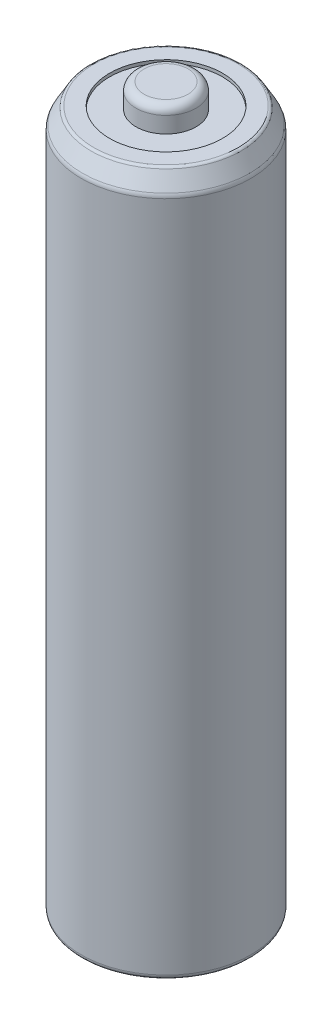
ISO-10303-21;
HEADER;
FILE_DESCRIPTION(('STEP AP214'),'2;1');
FILE_NAME('part.step','',(''),(''),'','','');
FILE_SCHEMA(('AUTOMOTIVE_DESIGN { 1 0 10303 214 1 1 1 1 }'));
ENDSEC;
DATA;
#1=APPLICATION_CONTEXT('core data for automotive mechanical design processes');
#2=APPLICATION_PROTOCOL_DEFINITION('international standard','automotive_design',2000,#1);
#3=PRODUCT_CONTEXT('',#1,'mechanical');
#4=PRODUCT('Part','Part','',(#3));
#5=PRODUCT_RELATED_PRODUCT_CATEGORY('part','',(#4));
#6=PRODUCT_DEFINITION_FORMATION('','',#4);
#7=PRODUCT_DEFINITION_CONTEXT('part definition',#1,'design');
#8=PRODUCT_DEFINITION('design','',#6,#7);
#9=PRODUCT_DEFINITION_SHAPE('','',#8);
#10=(LENGTH_UNIT() NAMED_UNIT(*) SI_UNIT(.MILLI.,.METRE.));
#11=(NAMED_UNIT(*) PLANE_ANGLE_UNIT() SI_UNIT($,.RADIAN.));
#12=(NAMED_UNIT(*) SI_UNIT($,.STERADIAN.) SOLID_ANGLE_UNIT());
#13=UNCERTAINTY_MEASURE_WITH_UNIT(LENGTH_MEASURE(1.E-05),#10,'distance_accuracy_value','');
#14=(GEOMETRIC_REPRESENTATION_CONTEXT(3) GLOBAL_UNCERTAINTY_ASSIGNED_CONTEXT((#13)) GLOBAL_UNIT_ASSIGNED_CONTEXT((#10,
#11,#12)) REPRESENTATION_CONTEXT('',''));
#15=CARTESIAN_POINT('',(0.,0.,0.));
#16=DIRECTION('',(0.,0.,1.));
#17=DIRECTION('',(1.,0.,0.));
#18=AXIS2_PLACEMENT_3D('',#15,#16,#17);
#19=CARTESIAN_POINT('',(-1.36,44.5,0.));
#20=DIRECTION('',(0.,-1.,0.));
#21=DIRECTION('',(0.,0.,-1.));
#22=AXIS2_PLACEMENT_3D('',#19,#20,#21);
#23=PLANE('',#22);
#24=CARTESIAN_POINT('',(0.,44.5,0.));
#25=DIRECTION('',(0.,-1.,0.));
#26=DIRECTION('',(0.,0.,1.));
#27=AXIS2_PLACEMENT_3D('',#24,#25,#26);
#28=CIRCLE('',#27,1.36);
#29=CARTESIAN_POINT('',(0.,44.5,1.36));
#30=VERTEX_POINT('',#29);
#31=EDGE_CURVE('E108',#30,#30,#28,.T.);
#32=ORIENTED_EDGE('',*,*,#31,.F.);
#33=EDGE_LOOP('',(#32));
#34=FACE_BOUND('',#33,.T.);
#35=ADVANCED_FACE('F14',(#34),#23,.F.);
#36=CARTESIAN_POINT('',(0.,44.,0.));
#37=DIRECTION('',(0.,-1.,0.));
#38=DIRECTION('',(0.,0.,-1.));
#39=AXIS2_PLACEMENT_3D('',#36,#37,#38);
#40=TOROIDAL_SURFACE('',#39,1.36,0.5);
#41=ORIENTED_EDGE('',*,*,#31,.T.);
#42=EDGE_LOOP('',(#41));
#43=FACE_BOUND('',#42,.T.);
#44=CARTESIAN_POINT('',(0.,44.,0.));
#45=DIRECTION('',(0.,-1.,0.));
#46=DIRECTION('',(0.,0.,-1.));
#47=AXIS2_PLACEMENT_3D('',#44,#45,#46);
#48=CIRCLE('',#47,1.86);
#49=CARTESIAN_POINT('',(0.,44.,-1.86));
#50=VERTEX_POINT('',#49);
#51=EDGE_CURVE('E100',#50,#50,#48,.T.);
#52=ORIENTED_EDGE('',*,*,#51,.F.);
#53=EDGE_LOOP('',(#52));
#54=FACE_BOUND('',#53,.T.);
#55=ADVANCED_FACE('F113',(#43,#54),#40,.T.);
#56=CARTESIAN_POINT('',(0.,0.,0.));
#57=DIRECTION('',(0.,-1.,0.));
#58=DIRECTION('',(0.,0.,-1.));
#59=AXIS2_PLACEMENT_3D('',#56,#57,#58);
#60=CYLINDRICAL_SURFACE('',#59,1.86);
#61=ORIENTED_EDGE('',*,*,#51,.T.);
#62=EDGE_LOOP('',(#61));
#63=FACE_BOUND('',#62,.T.);
#64=CARTESIAN_POINT('',(0.,43.,0.));
#65=DIRECTION('',(0.,-1.,0.));
#66=DIRECTION('',(0.,0.,-1.));
#67=AXIS2_PLACEMENT_3D('',#64,#65,#66);
#68=CIRCLE('',#67,1.86);
#69=CARTESIAN_POINT('',(0.,43.,-1.86));
#70=VERTEX_POINT('',#69);
#71=EDGE_CURVE('E18',#70,#70,#68,.F.);
#72=ORIENTED_EDGE('',*,*,#71,.T.);
#73=EDGE_LOOP('',(#72));
#74=FACE_BOUND('',#73,.T.);
#75=ADVANCED_FACE('F117',(#63,#74),#60,.T.);
#76=CARTESIAN_POINT('',(-3.5,43.,0.));
#77=DIRECTION('',(0.,-1.,0.));
#78=DIRECTION('',(0.,0.,-1.));
#79=AXIS2_PLACEMENT_3D('',#76,#77,#78);
#80=PLANE('',#79);
#81=ORIENTED_EDGE('',*,*,#71,.F.);
#82=EDGE_LOOP('',(#81));
#83=FACE_BOUND('',#82,.T.);
#84=CARTESIAN_POINT('',(0.,43.,0.));
#85=DIRECTION('',(0.,-1.,0.));
#86=DIRECTION('',(0.,0.,-1.));
#87=AXIS2_PLACEMENT_3D('',#84,#85,#86);
#88=CIRCLE('',#87,3.5);
#89=CARTESIAN_POINT('',(0.,43.,-3.5));
#90=VERTEX_POINT('',#89);
#91=EDGE_CURVE('E133',#90,#90,#88,.F.);
#92=ORIENTED_EDGE('',*,*,#91,.T.);
#93=EDGE_LOOP('',(#92));
#94=FACE_BOUND('',#93,.T.);
#95=ADVANCED_FACE('F141',(#83,#94),#80,.F.);
#96=CARTESIAN_POINT('',(0.,0.,0.));
#97=DIRECTION('',(0.,-1.,0.));
#98=DIRECTION('',(0.,0.,-1.));
#99=AXIS2_PLACEMENT_3D('',#96,#97,#98);
#100=CYLINDRICAL_SURFACE('',#99,3.5);
#101=ORIENTED_EDGE('',*,*,#91,.F.);
#102=EDGE_LOOP('',(#101));
#103=FACE_BOUND('',#102,.T.);
#104=CARTESIAN_POINT('',(0.,43.2,0.));
#105=DIRECTION('',(0.,-1.,0.));
#106=DIRECTION('',(0.,0.,-1.));
#107=AXIS2_PLACEMENT_3D('',#104,#105,#106);
#108=CIRCLE('',#107,3.5);
#109=CARTESIAN_POINT('',(0.,43.2,-3.5));
#110=VERTEX_POINT('',#109);
#111=EDGE_CURVE('E126',#110,#110,#108,.F.);
#112=ORIENTED_EDGE('',*,*,#111,.T.);
#113=EDGE_LOOP('',(#112));
#114=FACE_BOUND('',#113,.T.);
#115=ADVANCED_FACE('F143',(#103,#114),#100,.F.);
#116=CARTESIAN_POINT('',(-3.5,43.2,0.));
#117=DIRECTION('',(0.,-1.,0.));
#118=DIRECTION('',(0.,0.,-1.));
#119=AXIS2_PLACEMENT_3D('',#116,#117,#118);
#120=PLANE('',#119);
#121=ORIENTED_EDGE('',*,*,#111,.F.);
#122=EDGE_LOOP('',(#121));
#123=FACE_BOUND('',#122,.T.);
#124=CARTESIAN_POINT('',(0.,43.2,0.));
#125=DIRECTION('',(0.,-1.,0.));
#126=DIRECTION('',(0.,0.,1.));
#127=AXIS2_PLACEMENT_3D('',#124,#125,#126);
#128=CIRCLE('',#127,4.476794919243);
#129=CARTESIAN_POINT('',(0.,43.2,4.476794919243));
#130=VERTEX_POINT('',#129);
#131=EDGE_CURVE('E84',#130,#130,#128,.T.);
#132=ORIENTED_EDGE('',*,*,#131,.F.);
#133=EDGE_LOOP('',(#132));
#134=FACE_BOUND('',#133,.T.);
#135=ADVANCED_FACE('F72',(#123,#134),#120,.F.);
#136=CARTESIAN_POINT('',(0.,43.,0.));
#137=DIRECTION('',(0.,-1.,0.));
#138=DIRECTION('',(0.,0.,-1.));
#139=AXIS2_PLACEMENT_3D('',#136,#137,#138);
#140=TOROIDAL_SURFACE('',#139,4.476794919243,0.2);
#141=ORIENTED_EDGE('',*,*,#131,.T.);
#142=EDGE_LOOP('',(#141));
#143=FACE_BOUND('',#142,.T.);
#144=CARTESIAN_POINT('',(0.,43.1000000000381,0.));
#145=DIRECTION('',(0.,-1.,0.));
#146=DIRECTION('',(0.,0.,-1.));
#147=AXIS2_PLACEMENT_3D('',#144,#145,#146);
#148=CIRCLE('',#147,4.64999999996962);
#149=CARTESIAN_POINT('',(0.,43.1000000000381,-4.64999999996962));
#150=VERTEX_POINT('',#149);
#151=EDGE_CURVE('E81',#150,#150,#148,.T.);
#152=ORIENTED_EDGE('',*,*,#151,.F.);
#153=EDGE_LOOP('',(#152));
#154=FACE_BOUND('',#153,.T.);
#155=ADVANCED_FACE('F67',(#143,#154),#140,.T.);
#156=CARTESIAN_POINT('',(0.,0.,0.));
#157=DIRECTION('',(0.,1.,0.));
#158=DIRECTION('',(0.,0.,1.));
#159=AXIS2_PLACEMENT_3D('',#156,#157,#158);
#160=PLANE('',#159);
#161=CARTESIAN_POINT('',(0.,0.,0.));
#162=DIRECTION('',(0.,1.,0.));
#163=DIRECTION('',(0.,0.,1.));
#164=AXIS2_PLACEMENT_3D('',#161,#162,#163);
#165=CIRCLE('',#164,4.95);
#166=CARTESIAN_POINT('',(0.,0.,4.95));
#167=VERTEX_POINT('',#166);
#168=EDGE_CURVE('E54',#167,#167,#165,.T.);
#169=ORIENTED_EDGE('',*,*,#168,.F.);
#170=EDGE_LOOP('',(#169));
#171=FACE_BOUND('',#170,.T.);
#172=ADVANCED_FACE('F58',(#171),#160,.F.);
#173=CARTESIAN_POINT('',(0.,42.1767949194418,0.));
#174=DIRECTION('',(0.,-1.,0.));
#175=DIRECTION('',(0.,0.,-1.));
#176=AXIS2_PLACEMENT_3D('',#173,#174,#175);
#177=CONICAL_SURFACE('',#176,5.1830127017638,0.523598775579689);
#178=ORIENTED_EDGE('',*,*,#151,.T.);
#179=EDGE_LOOP('',(#178));
#180=FACE_BOUND('',#179,.T.);
#181=CARTESIAN_POINT('',(0.,42.1767949192431,0.));
#182=DIRECTION('',(0.,-1.,0.));
#183=DIRECTION('',(0.,0.,-1.));
#184=AXIS2_PLACEMENT_3D('',#181,#182,#183);
#185=CIRCLE('',#184,5.18301270189215);
#186=CARTESIAN_POINT('',(0.,42.1767949192431,-5.18301270189215));
#187=VERTEX_POINT('',#186);
#188=EDGE_CURVE('E27',#187,#187,#185,.T.);
#189=ORIENTED_EDGE('',*,*,#188,.F.);
#190=EDGE_LOOP('',(#189));
#191=FACE_BOUND('',#190,.T.);
#192=ADVANCED_FACE('F44',(#180,#191),#177,.T.);
#193=CARTESIAN_POINT('',(0.,0.3,0.));
#194=DIRECTION('',(0.,-1.,0.));
#195=DIRECTION('',(0.,0.,-1.));
#196=AXIS2_PLACEMENT_3D('',#193,#194,#195);
#197=TOROIDAL_SURFACE('',#196,4.95,0.3);
#198=CARTESIAN_POINT('',(0.,0.3,0.));
#199=DIRECTION('',(0.,-1.,0.));
#200=DIRECTION('',(0.,0.,-1.));
#201=AXIS2_PLACEMENT_3D('',#198,#199,#200);
#202=CIRCLE('',#201,5.25);
#203=CARTESIAN_POINT('',(0.,0.3,-5.25));
#204=VERTEX_POINT('',#203);
#205=EDGE_CURVE('E22',#204,#204,#202,.F.);
#206=ORIENTED_EDGE('',*,*,#205,.F.);
#207=EDGE_LOOP('',(#206));
#208=FACE_BOUND('',#207,.T.);
#209=ORIENTED_EDGE('',*,*,#168,.T.);
#210=EDGE_LOOP('',(#209));
#211=FACE_BOUND('',#210,.T.);
#212=ADVANCED_FACE('F39',(#208,#211),#197,.T.);
#213=CARTESIAN_POINT('',(0.,41.926794919243,0.));
#214=DIRECTION('',(0.,-1.,0.));
#215=DIRECTION('',(0.,0.,-1.));
#216=AXIS2_PLACEMENT_3D('',#213,#214,#215);
#217=TOROIDAL_SURFACE('',#216,4.75,0.5);
#218=ORIENTED_EDGE('',*,*,#188,.T.);
#219=EDGE_LOOP('',(#218));
#220=FACE_BOUND('',#219,.T.);
#221=CARTESIAN_POINT('',(0.,41.926794919243,0.));
#222=DIRECTION('',(0.,-1.,0.));
#223=DIRECTION('',(0.,0.,-1.));
#224=AXIS2_PLACEMENT_3D('',#221,#222,#223);
#225=CIRCLE('',#224,5.25);
#226=CARTESIAN_POINT('',(0.,41.926794919243,-5.25));
#227=VERTEX_POINT('',#226);
#228=EDGE_CURVE('E10',#227,#227,#225,.T.);
#229=ORIENTED_EDGE('',*,*,#228,.F.);
#230=EDGE_LOOP('',(#229));
#231=FACE_BOUND('',#230,.T.);
#232=ADVANCED_FACE('F34',(#220,#231),#217,.T.);
#233=CARTESIAN_POINT('',(0.,0.,0.));
#234=DIRECTION('',(0.,-1.,0.));
#235=DIRECTION('',(0.,0.,-1.));
#236=AXIS2_PLACEMENT_3D('',#233,#234,#235);
#237=CYLINDRICAL_SURFACE('',#236,5.25);
#238=ORIENTED_EDGE('',*,*,#228,.T.);
#239=EDGE_LOOP('',(#238));
#240=FACE_BOUND('',#239,.T.);
#241=ORIENTED_EDGE('',*,*,#205,.T.);
#242=EDGE_LOOP('',(#241));
#243=FACE_BOUND('',#242,.T.);
#244=ADVANCED_FACE('F38',(#240,#243),#237,.T.);
#245=CLOSED_SHELL('',(#35,#55,#75,#95,#115,#135,#155,#172,#192,#212,#232,#244));
#246=MANIFOLD_SOLID_BREP('B1',#245);
#247=ADVANCED_BREP_SHAPE_REPRESENTATION('',(#18,#246),#14);
#248=SHAPE_DEFINITION_REPRESENTATION(#9,#247);
ENDSEC;
END-ISO-10303-21;
